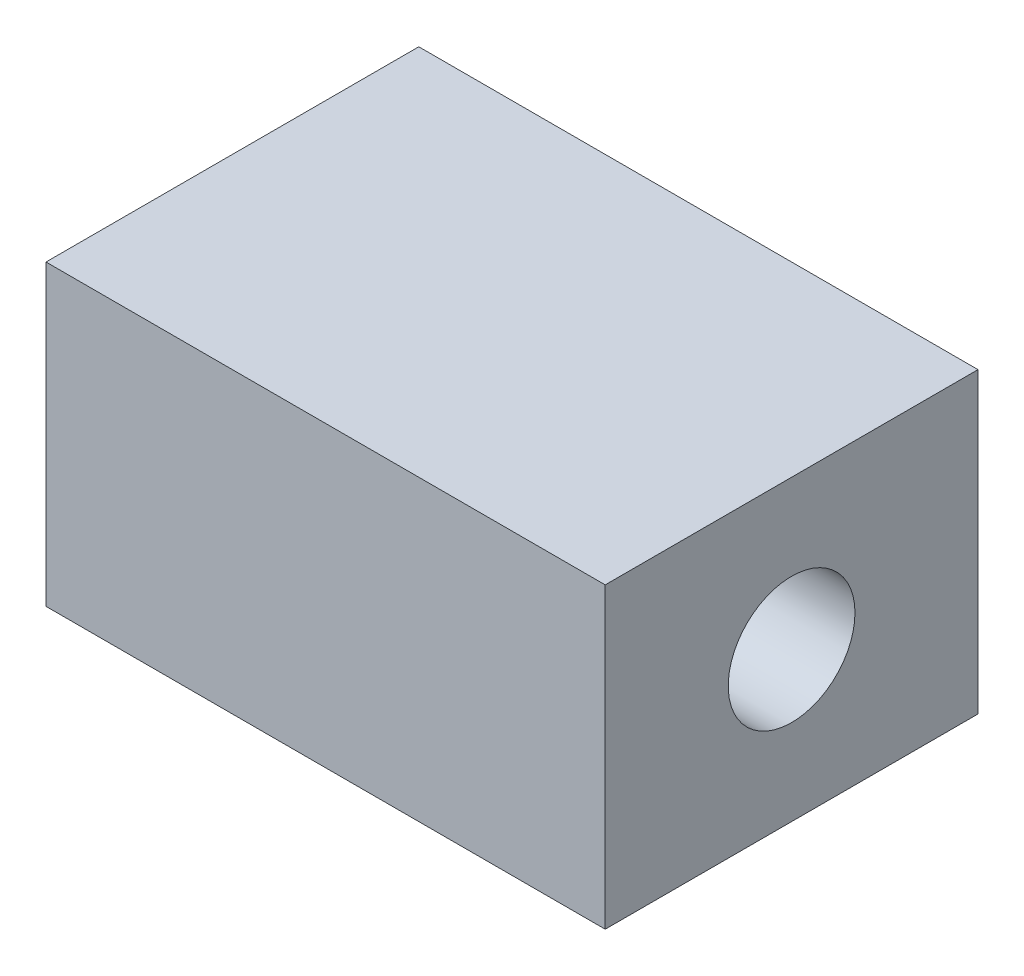
ISO-10303-21;
HEADER;
FILE_DESCRIPTION(('STEP AP214'),'2;1');
FILE_NAME('part.step','',(''),(''),'','','');
FILE_SCHEMA(('AUTOMOTIVE_DESIGN { 1 0 10303 214 1 1 1 1 }'));
ENDSEC;
DATA;
#1=APPLICATION_CONTEXT('core data for automotive mechanical design processes');
#2=APPLICATION_PROTOCOL_DEFINITION('international standard','automotive_design',2000,#1);
#3=PRODUCT_CONTEXT('',#1,'mechanical');
#4=PRODUCT('Part','Part','',(#3));
#5=PRODUCT_RELATED_PRODUCT_CATEGORY('part','',(#4));
#6=PRODUCT_DEFINITION_FORMATION('','',#4);
#7=PRODUCT_DEFINITION_CONTEXT('part definition',#1,'design');
#8=PRODUCT_DEFINITION('design','',#6,#7);
#9=PRODUCT_DEFINITION_SHAPE('','',#8);
#10=(LENGTH_UNIT() NAMED_UNIT(*) SI_UNIT(.MILLI.,.METRE.));
#11=(NAMED_UNIT(*) PLANE_ANGLE_UNIT() SI_UNIT($,.RADIAN.));
#12=(NAMED_UNIT(*) SI_UNIT($,.STERADIAN.) SOLID_ANGLE_UNIT());
#13=UNCERTAINTY_MEASURE_WITH_UNIT(LENGTH_MEASURE(1.E-05),#10,'distance_accuracy_value','');
#14=(GEOMETRIC_REPRESENTATION_CONTEXT(3) GLOBAL_UNCERTAINTY_ASSIGNED_CONTEXT((#13)) GLOBAL_UNIT_ASSIGNED_CONTEXT((#10,
#11,#12)) REPRESENTATION_CONTEXT('',''));
#15=CARTESIAN_POINT('',(0.,0.,0.));
#16=DIRECTION('',(0.,0.,1.));
#17=DIRECTION('',(1.,0.,0.));
#18=AXIS2_PLACEMENT_3D('',#15,#16,#17);
#19=CARTESIAN_POINT('',(15.,8.,10.));
#20=DIRECTION('',(-1.,0.,0.));
#21=DIRECTION('',(0.,0.,1.));
#22=AXIS2_PLACEMENT_3D('',#19,#20,#21);
#23=PLANE('',#22);
#24=CARTESIAN_POINT('',(15.,0.,0.));
#25=DIRECTION('',(1.,0.,0.));
#26=DIRECTION('',(0.,0.,-1.));
#27=AXIS2_PLACEMENT_3D('',#24,#25,#26);
#28=CIRCLE('',#27,3.4);
#29=CARTESIAN_POINT('',(15.,0.,-3.4));
#30=VERTEX_POINT('',#29);
#31=EDGE_CURVE('E116',#30,#30,#28,.T.);
#32=ORIENTED_EDGE('',*,*,#31,.F.);
#33=EDGE_LOOP('',(#32));
#34=FACE_BOUND('',#33,.T.);
#35=DIRECTION('',(0.,0.,-1.));
#36=VECTOR('',#35,1.);
#37=CARTESIAN_POINT('',(15.,-8.,10.));
#38=LINE('',#37,#36);
#39=CARTESIAN_POINT('',(15.,-8.,10.));
#40=VERTEX_POINT('',#39);
#41=CARTESIAN_POINT('',(15.,-8.,-10.));
#42=VERTEX_POINT('',#41);
#43=EDGE_CURVE('E100',#40,#42,#38,.T.);
#44=ORIENTED_EDGE('',*,*,#43,.T.);
#45=DIRECTION('',(0.,-1.,0.));
#46=VECTOR('',#45,1.);
#47=CARTESIAN_POINT('',(15.,8.,-10.));
#48=LINE('',#47,#46);
#49=CARTESIAN_POINT('',(15.,8.,-10.));
#50=VERTEX_POINT('',#49);
#51=EDGE_CURVE('E11',#50,#42,#48,.T.);
#52=ORIENTED_EDGE('',*,*,#51,.F.);
#53=DIRECTION('',(0.,0.,-1.));
#54=VECTOR('',#53,1.);
#55=CARTESIAN_POINT('',(15.,8.,10.));
#56=LINE('',#55,#54);
#57=CARTESIAN_POINT('',(15.,8.,10.));
#58=VERTEX_POINT('',#57);
#59=EDGE_CURVE('E88',#58,#50,#56,.T.);
#60=ORIENTED_EDGE('',*,*,#59,.F.);
#61=DIRECTION('',(0.,-1.,0.));
#62=VECTOR('',#61,1.);
#63=CARTESIAN_POINT('',(15.,8.,10.));
#64=LINE('',#63,#62);
#65=EDGE_CURVE('E96',#58,#40,#64,.T.);
#66=ORIENTED_EDGE('',*,*,#65,.T.);
#67=EDGE_LOOP('',(#44,#52,#60,#66));
#68=FACE_BOUND('',#67,.T.);
#69=ADVANCED_FACE('F37',(#34,#68),#23,.F.);
#70=CARTESIAN_POINT('',(-15.,8.,-10.));
#71=DIRECTION('',(0.,0.,1.));
#72=DIRECTION('',(1.,0.,0.));
#73=AXIS2_PLACEMENT_3D('',#70,#71,#72);
#74=PLANE('',#73);
#75=DIRECTION('',(-1.,0.,0.));
#76=VECTOR('',#75,1.);
#77=CARTESIAN_POINT('',(-15.,-8.,-10.));
#78=LINE('',#77,#76);
#79=CARTESIAN_POINT('',(-15.,-8.,-10.));
#80=VERTEX_POINT('',#79);
#81=EDGE_CURVE('E92',#42,#80,#78,.T.);
#82=ORIENTED_EDGE('',*,*,#81,.T.);
#83=DIRECTION('',(0.,-1.,0.));
#84=VECTOR('',#83,1.);
#85=CARTESIAN_POINT('',(-15.,8.,-10.));
#86=LINE('',#85,#84);
#87=CARTESIAN_POINT('',(-15.,8.,-10.));
#88=VERTEX_POINT('',#87);
#89=EDGE_CURVE('E45',#88,#80,#86,.T.);
#90=ORIENTED_EDGE('',*,*,#89,.F.);
#91=DIRECTION('',(-1.,0.,0.));
#92=VECTOR('',#91,1.);
#93=CARTESIAN_POINT('',(-15.,8.,-10.));
#94=LINE('',#93,#92);
#95=EDGE_CURVE('E83',#50,#88,#94,.T.);
#96=ORIENTED_EDGE('',*,*,#95,.F.);
#97=ORIENTED_EDGE('',*,*,#51,.T.);
#98=EDGE_LOOP('',(#82,#90,#96,#97));
#99=FACE_BOUND('',#98,.T.);
#100=ADVANCED_FACE('F91',(#99),#74,.F.);
#101=CARTESIAN_POINT('',(-15.,8.,10.));
#102=DIRECTION('',(1.,0.,0.));
#103=DIRECTION('',(0.,0.,-1.));
#104=AXIS2_PLACEMENT_3D('',#101,#102,#103);
#105=PLANE('',#104);
#106=CARTESIAN_POINT('',(-15.,0.,0.));
#107=DIRECTION('',(1.,0.,0.));
#108=DIRECTION('',(0.,0.,-1.));
#109=AXIS2_PLACEMENT_3D('',#106,#107,#108);
#110=CIRCLE('',#109,3.4);
#111=CARTESIAN_POINT('',(-15.,0.,-3.4));
#112=VERTEX_POINT('',#111);
#113=EDGE_CURVE('E103',#112,#112,#110,.T.);
#114=ORIENTED_EDGE('',*,*,#113,.T.);
#115=EDGE_LOOP('',(#114));
#116=FACE_BOUND('',#115,.T.);
#117=DIRECTION('',(0.,0.,1.));
#118=VECTOR('',#117,1.);
#119=CARTESIAN_POINT('',(-15.,-8.,10.));
#120=LINE('',#119,#118);
#121=CARTESIAN_POINT('',(-15.,-8.,10.));
#122=VERTEX_POINT('',#121);
#123=EDGE_CURVE('E70',#80,#122,#120,.T.);
#124=ORIENTED_EDGE('',*,*,#123,.T.);
#125=DIRECTION('',(0.,-1.,0.));
#126=VECTOR('',#125,1.);
#127=CARTESIAN_POINT('',(-15.,8.,10.));
#128=LINE('',#127,#126);
#129=CARTESIAN_POINT('',(-15.,8.,10.));
#130=VERTEX_POINT('',#129);
#131=EDGE_CURVE('E93',#130,#122,#128,.T.);
#132=ORIENTED_EDGE('',*,*,#131,.F.);
#133=DIRECTION('',(0.,0.,1.));
#134=VECTOR('',#133,1.);
#135=CARTESIAN_POINT('',(-15.,8.,10.));
#136=LINE('',#135,#134);
#137=EDGE_CURVE('E86',#88,#130,#136,.T.);
#138=ORIENTED_EDGE('',*,*,#137,.F.);
#139=ORIENTED_EDGE('',*,*,#89,.T.);
#140=EDGE_LOOP('',(#124,#132,#138,#139));
#141=FACE_BOUND('',#140,.T.);
#142=ADVANCED_FACE('F94',(#116,#141),#105,.F.);
#143=CARTESIAN_POINT('',(-15.,8.,10.));
#144=DIRECTION('',(0.,0.,-1.));
#145=DIRECTION('',(-1.,0.,0.));
#146=AXIS2_PLACEMENT_3D('',#143,#144,#145);
#147=PLANE('',#146);
#148=DIRECTION('',(1.,0.,0.));
#149=VECTOR('',#148,1.);
#150=CARTESIAN_POINT('',(-15.,-8.,10.));
#151=LINE('',#150,#149);
#152=EDGE_CURVE('E76',#122,#40,#151,.T.);
#153=ORIENTED_EDGE('',*,*,#152,.T.);
#154=ORIENTED_EDGE('',*,*,#65,.F.);
#155=DIRECTION('',(1.,0.,0.));
#156=VECTOR('',#155,1.);
#157=CARTESIAN_POINT('',(-15.,8.,10.));
#158=LINE('',#157,#156);
#159=EDGE_CURVE('E53',#130,#58,#158,.T.);
#160=ORIENTED_EDGE('',*,*,#159,.F.);
#161=ORIENTED_EDGE('',*,*,#131,.T.);
#162=EDGE_LOOP('',(#153,#154,#160,#161));
#163=FACE_BOUND('',#162,.T.);
#164=ADVANCED_FACE('F108',(#163),#147,.F.);
#165=CARTESIAN_POINT('',(0.,8.,0.));
#166=DIRECTION('',(0.,-1.,0.));
#167=DIRECTION('',(0.,0.,-1.));
#168=AXIS2_PLACEMENT_3D('',#165,#166,#167);
#169=PLANE('',#168);
#170=ORIENTED_EDGE('',*,*,#59,.T.);
#171=ORIENTED_EDGE('',*,*,#95,.T.);
#172=ORIENTED_EDGE('',*,*,#137,.T.);
#173=ORIENTED_EDGE('',*,*,#159,.T.);
#174=EDGE_LOOP('',(#170,#171,#172,#173));
#175=FACE_BOUND('',#174,.T.);
#176=ADVANCED_FACE('F84',(#175),#169,.F.);
#177=CARTESIAN_POINT('',(0.,-8.,0.));
#178=DIRECTION('',(0.,-1.,0.));
#179=DIRECTION('',(0.,0.,-1.));
#180=AXIS2_PLACEMENT_3D('',#177,#178,#179);
#181=PLANE('',#180);
#182=ORIENTED_EDGE('',*,*,#43,.F.);
#183=ORIENTED_EDGE('',*,*,#152,.F.);
#184=ORIENTED_EDGE('',*,*,#123,.F.);
#185=ORIENTED_EDGE('',*,*,#81,.F.);
#186=EDGE_LOOP('',(#182,#183,#184,#185));
#187=FACE_BOUND('',#186,.T.);
#188=ADVANCED_FACE('F111',(#187),#181,.T.);
#189=CARTESIAN_POINT('',(-15.,0.,0.));
#190=DIRECTION('',(1.,0.,0.));
#191=DIRECTION('',(0.,0.,-1.));
#192=AXIS2_PLACEMENT_3D('',#189,#190,#191);
#193=CYLINDRICAL_SURFACE('',#192,3.4);
#194=CARTESIAN_POINT('',(-15.,0.,-3.4));
#195=CARTESIAN_POINT('',(-14.6875,0.,-3.4));
#196=CARTESIAN_POINT('',(-14.375,0.,-3.4));
#197=CARTESIAN_POINT('',(-13.75,0.,-3.4));
#198=CARTESIAN_POINT('',(-13.4375,0.,-3.4));
#199=CARTESIAN_POINT('',(-12.8125,0.,-3.4));
#200=CARTESIAN_POINT('',(-12.5,0.,-3.4));
#201=CARTESIAN_POINT('',(-11.875,0.,-3.4));
#202=CARTESIAN_POINT('',(-11.5625,0.,-3.4));
#203=CARTESIAN_POINT('',(-10.9375,0.,-3.4));
#204=CARTESIAN_POINT('',(-10.625,0.,-3.4));
#205=CARTESIAN_POINT('',(-10.,0.,-3.4));
#206=CARTESIAN_POINT('',(-9.6875,0.,-3.4));
#207=CARTESIAN_POINT('',(-9.0625,0.,-3.4));
#208=CARTESIAN_POINT('',(-8.75,0.,-3.4));
#209=CARTESIAN_POINT('',(-8.125,0.,-3.4));
#210=CARTESIAN_POINT('',(-7.8125,0.,-3.4));
#211=CARTESIAN_POINT('',(-7.1875,0.,-3.4));
#212=CARTESIAN_POINT('',(-6.875,0.,-3.4));
#213=CARTESIAN_POINT('',(-6.25,0.,-3.4));
#214=CARTESIAN_POINT('',(-5.9375,0.,-3.4));
#215=CARTESIAN_POINT('',(-5.3125,0.,-3.4));
#216=CARTESIAN_POINT('',(-5.,0.,-3.4));
#217=CARTESIAN_POINT('',(-4.375,0.,-3.4));
#218=CARTESIAN_POINT('',(-4.0625,0.,-3.4));
#219=CARTESIAN_POINT('',(-3.4375,0.,-3.4));
#220=CARTESIAN_POINT('',(-3.125,0.,-3.4));
#221=CARTESIAN_POINT('',(-2.5,0.,-3.4));
#222=CARTESIAN_POINT('',(-2.1875,0.,-3.4));
#223=CARTESIAN_POINT('',(-1.5625,0.,-3.4));
#224=CARTESIAN_POINT('',(-1.25,0.,-3.4));
#225=CARTESIAN_POINT('',(-0.625000000000002,0.,-3.4));
#226=CARTESIAN_POINT('',(-0.312500000000002,0.,-3.4));
#227=CARTESIAN_POINT('',(0.312499999999999,0.,-3.4));
#228=CARTESIAN_POINT('',(0.624999999999999,0.,-3.4));
#229=CARTESIAN_POINT('',(1.25,0.,-3.4));
#230=CARTESIAN_POINT('',(1.5625,0.,-3.4));
#231=CARTESIAN_POINT('',(2.1875,0.,-3.4));
#232=CARTESIAN_POINT('',(2.5,0.,-3.4));
#233=CARTESIAN_POINT('',(3.125,0.,-3.4));
#234=CARTESIAN_POINT('',(3.4375,0.,-3.4));
#235=CARTESIAN_POINT('',(4.0625,0.,-3.4));
#236=CARTESIAN_POINT('',(4.375,0.,-3.4));
#237=CARTESIAN_POINT('',(5.,0.,-3.4));
#238=CARTESIAN_POINT('',(5.3125,0.,-3.4));
#239=CARTESIAN_POINT('',(5.9375,0.,-3.4));
#240=CARTESIAN_POINT('',(6.25,0.,-3.4));
#241=CARTESIAN_POINT('',(6.875,0.,-3.4));
#242=CARTESIAN_POINT('',(7.1875,0.,-3.4));
#243=CARTESIAN_POINT('',(7.8125,0.,-3.4));
#244=CARTESIAN_POINT('',(8.125,0.,-3.4));
#245=CARTESIAN_POINT('',(8.75,0.,-3.4));
#246=CARTESIAN_POINT('',(9.0625,0.,-3.4));
#247=CARTESIAN_POINT('',(9.6875,0.,-3.4));
#248=CARTESIAN_POINT('',(10.,0.,-3.4));
#249=CARTESIAN_POINT('',(10.625,0.,-3.4));
#250=CARTESIAN_POINT('',(10.9375,0.,-3.4));
#251=CARTESIAN_POINT('',(11.5625,0.,-3.4));
#252=CARTESIAN_POINT('',(11.875,0.,-3.4));
#253=CARTESIAN_POINT('',(12.5,0.,-3.4));
#254=CARTESIAN_POINT('',(12.8125,0.,-3.4));
#255=CARTESIAN_POINT('',(13.4375,0.,-3.4));
#256=CARTESIAN_POINT('',(13.75,0.,-3.4));
#257=CARTESIAN_POINT('',(14.375,0.,-3.4));
#258=CARTESIAN_POINT('',(14.6875,0.,-3.4));
#259=CARTESIAN_POINT('',(15.,0.,-3.4));
#260=B_SPLINE_CURVE_WITH_KNOTS('',3,(#194,#195,#196,#197,#198,#199,#200,#201,#202,#203,#204,
#205,#206,#207,#208,#209,#210,#211,#212,#213,#214,#215,#216,#217,#218,#219,#220,#221,#222,#223,
#224,#225,#226,#227,#228,#229,#230,#231,#232,#233,#234,#235,#236,#237,#238,#239,#240,#241,#242,
#243,#244,#245,#246,#247,#248,#249,#250,#251,#252,#253,#254,#255,#256,#257,#258,#259),
.UNSPECIFIED.,.F.,.F.,(4,2,2,2,2,2,2,2,2,2,2,2,2,2,2,2,2,2,2,2,2,2,2,2,2,2,2,2,2,2,2,2,4),(0.,
0.937500000000001,1.875,2.8125,3.75,4.6875,5.625,6.5625,7.5,8.4375,9.375,10.3125,11.25,12.1875,
13.125,14.0625,15.,15.9375,16.875,17.8125,18.75,19.6875,20.625,21.5625,22.5,23.4375,24.375,
25.3125,26.25,27.1875,28.125,29.0625,30.),.UNSPECIFIED.);
#261=EDGE_CURVE('BSEAM120',#112,#30,#260,.T.);
#262=ORIENTED_EDGE('',*,*,#113,.F.);
#263=ORIENTED_EDGE('',*,*,#31,.T.);
#264=ORIENTED_EDGE('',*,*,#261,.T.);
#265=ORIENTED_EDGE('',*,*,#261,.F.);
#266=EDGE_LOOP('',(#262,#264,#263,#265));
#267=FACE_BOUND('',#266,.T.);
#268=ADVANCED_FACE('F120',(#267),#193,.F.);
#269=CLOSED_SHELL('',(#69,#100,#142,#164,#176,#188,#268));
#270=MANIFOLD_SOLID_BREP('B2',#269);
#271=ADVANCED_BREP_SHAPE_REPRESENTATION('',(#18,#270),#14);
#272=SHAPE_DEFINITION_REPRESENTATION(#9,#271);
ENDSEC;
END-ISO-10303-21;
